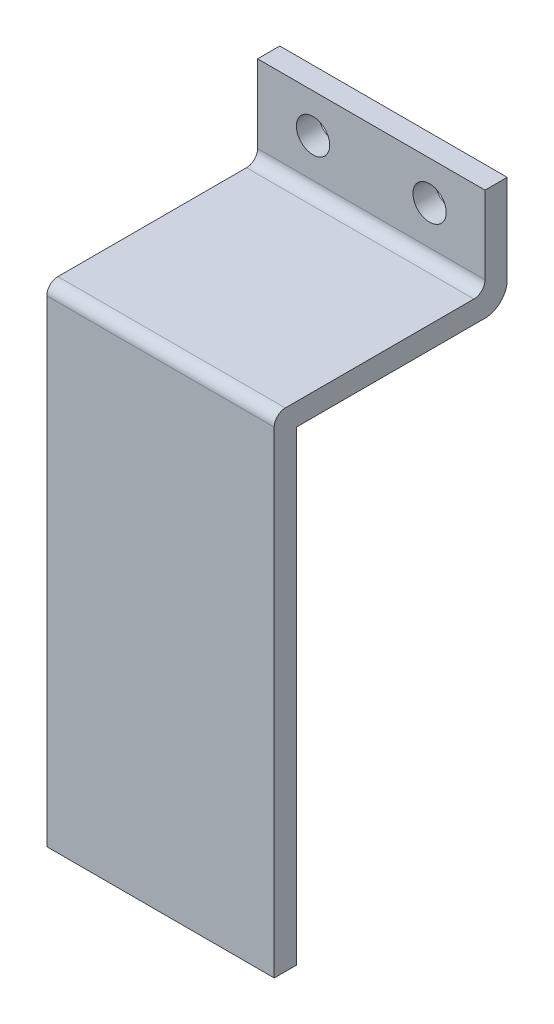
ISO-10303-21;
HEADER;
FILE_DESCRIPTION(('STEP AP214'),'2;1');
FILE_NAME('part.step','',(''),(''),'','','');
FILE_SCHEMA(('AUTOMOTIVE_DESIGN { 1 0 10303 214 1 1 1 1 }'));
ENDSEC;
DATA;
#1=APPLICATION_CONTEXT('core data for automotive mechanical design processes');
#2=APPLICATION_PROTOCOL_DEFINITION('international standard','automotive_design',2000,#1);
#3=PRODUCT_CONTEXT('',#1,'mechanical');
#4=PRODUCT('Part','Part','',(#3));
#5=PRODUCT_RELATED_PRODUCT_CATEGORY('part','',(#4));
#6=PRODUCT_DEFINITION_FORMATION('','',#4);
#7=PRODUCT_DEFINITION_CONTEXT('part definition',#1,'design');
#8=PRODUCT_DEFINITION('design','',#6,#7);
#9=PRODUCT_DEFINITION_SHAPE('','',#8);
#10=(LENGTH_UNIT() NAMED_UNIT(*) SI_UNIT(.MILLI.,.METRE.));
#11=(NAMED_UNIT(*) PLANE_ANGLE_UNIT() SI_UNIT($,.RADIAN.));
#12=(NAMED_UNIT(*) SI_UNIT($,.STERADIAN.) SOLID_ANGLE_UNIT());
#13=UNCERTAINTY_MEASURE_WITH_UNIT(LENGTH_MEASURE(1.E-05),#10,'distance_accuracy_value','');
#14=(GEOMETRIC_REPRESENTATION_CONTEXT(3) GLOBAL_UNCERTAINTY_ASSIGNED_CONTEXT((#13)) GLOBAL_UNIT_ASSIGNED_CONTEXT((#10,
#11,#12)) REPRESENTATION_CONTEXT('',''));
#15=CARTESIAN_POINT('',(0.,0.,0.));
#16=DIRECTION('',(0.,0.,1.));
#17=DIRECTION('',(1.,0.,0.));
#18=AXIS2_PLACEMENT_3D('',#15,#16,#17);
#19=CARTESIAN_POINT('',(20.5,43.,-1.));
#20=DIRECTION('',(-1.,0.,0.));
#21=DIRECTION('',(0.,0.,1.));
#22=AXIS2_PLACEMENT_3D('',#19,#20,#21);
#23=CYLINDRICAL_SURFACE('',#22,1.);
#24=CARTESIAN_POINT('',(0.,43.,-1.));
#25=DIRECTION('',(-1.,0.,0.));
#26=DIRECTION('',(0.,0.,1.));
#27=AXIS2_PLACEMENT_3D('',#24,#25,#26);
#28=CIRCLE('',#27,1.);
#29=CARTESIAN_POINT('',(0.,43.,0.));
#30=VERTEX_POINT('',#29);
#31=CARTESIAN_POINT('',(0.,44.,-1.));
#32=VERTEX_POINT('',#31);
#33=EDGE_CURVE('E147',#30,#32,#28,.T.);
#34=ORIENTED_EDGE('',*,*,#33,.F.);
#35=DIRECTION('',(-1.,0.,0.));
#36=VECTOR('',#35,1.);
#37=CARTESIAN_POINT('',(20.5,43.,0.));
#38=LINE('',#37,#36);
#39=CARTESIAN_POINT('',(20.5,43.,0.));
#40=VERTEX_POINT('',#39);
#41=EDGE_CURVE('E11',#40,#30,#38,.T.);
#42=ORIENTED_EDGE('',*,*,#41,.F.);
#43=CARTESIAN_POINT('',(20.5,43.,-1.));
#44=DIRECTION('',(-1.,0.,0.));
#45=DIRECTION('',(0.,0.,1.));
#46=AXIS2_PLACEMENT_3D('',#43,#44,#45);
#47=CIRCLE('',#46,1.);
#48=CARTESIAN_POINT('',(20.5,44.,-1.));
#49=VERTEX_POINT('',#48);
#50=EDGE_CURVE('E175',#40,#49,#47,.T.);
#51=ORIENTED_EDGE('',*,*,#50,.T.);
#52=DIRECTION('',(-1.,0.,0.));
#53=VECTOR('',#52,1.);
#54=CARTESIAN_POINT('',(20.5,44.,-1.));
#55=LINE('',#54,#53);
#56=EDGE_CURVE('E36',#49,#32,#55,.T.);
#57=ORIENTED_EDGE('',*,*,#56,.T.);
#58=EDGE_LOOP('',(#34,#42,#51,#57));
#59=FACE_BOUND('',#58,.T.);
#60=ADVANCED_FACE('F33',(#59),#23,.T.);
#61=CARTESIAN_POINT('',(20.5,0.,0.));
#62=DIRECTION('',(0.,0.,1.));
#63=DIRECTION('',(1.,0.,0.));
#64=AXIS2_PLACEMENT_3D('',#61,#62,#63);
#65=PLANE('',#64);
#66=DIRECTION('',(0.,1.,0.));
#67=VECTOR('',#66,1.);
#68=CARTESIAN_POINT('',(0.,0.,0.));
#69=LINE('',#68,#67);
#70=CARTESIAN_POINT('',(0.,0.,0.));
#71=VERTEX_POINT('',#70);
#72=EDGE_CURVE('E173',#71,#30,#69,.T.);
#73=ORIENTED_EDGE('',*,*,#72,.F.);
#74=DIRECTION('',(-1.,0.,0.));
#75=VECTOR('',#74,1.);
#76=CARTESIAN_POINT('',(20.5,0.,0.));
#77=LINE('',#76,#75);
#78=CARTESIAN_POINT('',(20.5,0.,0.));
#79=VERTEX_POINT('',#78);
#80=EDGE_CURVE('E42',#79,#71,#77,.T.);
#81=ORIENTED_EDGE('',*,*,#80,.F.);
#82=DIRECTION('',(0.,1.,0.));
#83=VECTOR('',#82,1.);
#84=CARTESIAN_POINT('',(20.5,0.,0.));
#85=LINE('',#84,#83);
#86=EDGE_CURVE('E127',#79,#40,#85,.T.);
#87=ORIENTED_EDGE('',*,*,#86,.T.);
#88=ORIENTED_EDGE('',*,*,#41,.T.);
#89=EDGE_LOOP('',(#73,#81,#87,#88));
#90=FACE_BOUND('',#89,.T.);
#91=ADVANCED_FACE('F195',(#90),#65,.T.);
#92=CARTESIAN_POINT('',(20.5,0.,0.));
#93=DIRECTION('',(0.,1.,0.));
#94=DIRECTION('',(0.,0.,1.));
#95=AXIS2_PLACEMENT_3D('',#92,#93,#94);
#96=PLANE('',#95);
#97=DIRECTION('',(0.,0.,-1.));
#98=VECTOR('',#97,1.);
#99=CARTESIAN_POINT('',(0.,0.,0.));
#100=LINE('',#99,#98);
#101=CARTESIAN_POINT('',(0.,0.,-2.));
#102=VERTEX_POINT('',#101);
#103=EDGE_CURVE('E132',#71,#102,#100,.T.);
#104=ORIENTED_EDGE('',*,*,#103,.T.);
#105=DIRECTION('',(-1.,0.,0.));
#106=VECTOR('',#105,1.);
#107=CARTESIAN_POINT('',(20.5,0.,-2.));
#108=LINE('',#107,#106);
#109=CARTESIAN_POINT('',(20.5,0.,-2.));
#110=VERTEX_POINT('',#109);
#111=EDGE_CURVE('E130',#110,#102,#108,.T.);
#112=ORIENTED_EDGE('',*,*,#111,.F.);
#113=DIRECTION('',(0.,0.,-1.));
#114=VECTOR('',#113,1.);
#115=CARTESIAN_POINT('',(20.5,0.,0.));
#116=LINE('',#115,#114);
#117=EDGE_CURVE('E121',#79,#110,#116,.T.);
#118=ORIENTED_EDGE('',*,*,#117,.F.);
#119=ORIENTED_EDGE('',*,*,#80,.T.);
#120=EDGE_LOOP('',(#104,#112,#118,#119));
#121=FACE_BOUND('',#120,.T.);
#122=ADVANCED_FACE('F131',(#121),#96,.F.);
#123=CARTESIAN_POINT('',(20.5,0.,-2.));
#124=DIRECTION('',(0.,0.,1.));
#125=DIRECTION('',(1.,0.,0.));
#126=AXIS2_PLACEMENT_3D('',#123,#124,#125);
#127=PLANE('',#126);
#128=DIRECTION('',(0.,1.,0.));
#129=VECTOR('',#128,1.);
#130=CARTESIAN_POINT('',(0.,0.,-2.));
#131=LINE('',#130,#129);
#132=CARTESIAN_POINT('',(0.,42.,-2.));
#133=VERTEX_POINT('',#132);
#134=EDGE_CURVE('E170',#102,#133,#131,.T.);
#135=ORIENTED_EDGE('',*,*,#134,.T.);
#136=DIRECTION('',(-1.,0.,0.));
#137=VECTOR('',#136,1.);
#138=CARTESIAN_POINT('',(20.5,42.,-2.));
#139=LINE('',#138,#137);
#140=CARTESIAN_POINT('',(20.5,42.,-2.));
#141=VERTEX_POINT('',#140);
#142=EDGE_CURVE('E135',#141,#133,#139,.T.);
#143=ORIENTED_EDGE('',*,*,#142,.F.);
#144=DIRECTION('',(0.,1.,0.));
#145=VECTOR('',#144,1.);
#146=CARTESIAN_POINT('',(20.5,0.,-2.));
#147=LINE('',#146,#145);
#148=EDGE_CURVE('E125',#110,#141,#147,.T.);
#149=ORIENTED_EDGE('',*,*,#148,.F.);
#150=ORIENTED_EDGE('',*,*,#111,.T.);
#151=EDGE_LOOP('',(#135,#143,#149,#150));
#152=FACE_BOUND('',#151,.T.);
#153=ADVANCED_FACE('F137',(#152),#127,.F.);
#154=CARTESIAN_POINT('',(20.5,42.,-2.));
#155=DIRECTION('',(0.,1.,0.));
#156=DIRECTION('',(0.,0.,1.));
#157=AXIS2_PLACEMENT_3D('',#154,#155,#156);
#158=PLANE('',#157);
#159=DIRECTION('',(0.,0.,-1.));
#160=VECTOR('',#159,1.);
#161=CARTESIAN_POINT('',(0.,42.,-2.));
#162=LINE('',#161,#160);
#163=CARTESIAN_POINT('',(0.,42.,-19.));
#164=VERTEX_POINT('',#163);
#165=EDGE_CURVE('E168',#133,#164,#162,.T.);
#166=ORIENTED_EDGE('',*,*,#165,.T.);
#167=DIRECTION('',(-1.,0.,0.));
#168=VECTOR('',#167,1.);
#169=CARTESIAN_POINT('',(20.5,42.,-19.));
#170=LINE('',#169,#168);
#171=CARTESIAN_POINT('',(20.5,42.,-19.));
#172=VERTEX_POINT('',#171);
#173=EDGE_CURVE('E179',#172,#164,#170,.T.);
#174=ORIENTED_EDGE('',*,*,#173,.F.);
#175=DIRECTION('',(0.,0.,-1.));
#176=VECTOR('',#175,1.);
#177=CARTESIAN_POINT('',(20.5,42.,-2.));
#178=LINE('',#177,#176);
#179=EDGE_CURVE('E140',#141,#172,#178,.T.);
#180=ORIENTED_EDGE('',*,*,#179,.F.);
#181=ORIENTED_EDGE('',*,*,#142,.T.);
#182=EDGE_LOOP('',(#166,#174,#180,#181));
#183=FACE_BOUND('',#182,.T.);
#184=ADVANCED_FACE('F208',(#183),#158,.F.);
#185=CARTESIAN_POINT('',(20.5,44.,-19.));
#186=DIRECTION('',(-1.,0.,0.));
#187=DIRECTION('',(0.,0.,1.));
#188=AXIS2_PLACEMENT_3D('',#185,#186,#187);
#189=CYLINDRICAL_SURFACE('',#188,2.);
#190=CARTESIAN_POINT('',(0.,44.,-19.));
#191=DIRECTION('',(1.,0.,0.));
#192=DIRECTION('',(0.,0.,-1.));
#193=AXIS2_PLACEMENT_3D('',#190,#191,#192);
#194=CIRCLE('',#193,2.);
#195=CARTESIAN_POINT('',(0.,44.,-21.));
#196=VERTEX_POINT('',#195);
#197=EDGE_CURVE('E166',#164,#196,#194,.T.);
#198=ORIENTED_EDGE('',*,*,#197,.T.);
#199=DIRECTION('',(-1.,0.,0.));
#200=VECTOR('',#199,1.);
#201=CARTESIAN_POINT('',(20.5,44.,-21.));
#202=LINE('',#201,#200);
#203=CARTESIAN_POINT('',(20.5,44.,-21.));
#204=VERTEX_POINT('',#203);
#205=EDGE_CURVE('E182',#204,#196,#202,.T.);
#206=ORIENTED_EDGE('',*,*,#205,.F.);
#207=CARTESIAN_POINT('',(20.5,44.,-19.));
#208=DIRECTION('',(1.,0.,0.));
#209=DIRECTION('',(0.,0.,-1.));
#210=AXIS2_PLACEMENT_3D('',#207,#208,#209);
#211=CIRCLE('',#210,2.);
#212=EDGE_CURVE('E142',#172,#204,#211,.T.);
#213=ORIENTED_EDGE('',*,*,#212,.F.);
#214=ORIENTED_EDGE('',*,*,#173,.T.);
#215=EDGE_LOOP('',(#198,#206,#213,#214));
#216=FACE_BOUND('',#215,.T.);
#217=ADVANCED_FACE('F211',(#216),#189,.T.);
#218=CARTESIAN_POINT('',(20.5,44.,-21.));
#219=DIRECTION('',(0.,0.,1.));
#220=DIRECTION('',(1.,0.,0.));
#221=AXIS2_PLACEMENT_3D('',#218,#219,#220);
#222=PLANE('',#221);
#223=CARTESIAN_POINT('',(5.,48.5,-21.));
#224=DIRECTION('',(0.,0.,1.));
#225=DIRECTION('',(1.,0.,0.));
#226=AXIS2_PLACEMENT_3D('',#223,#224,#225);
#227=CIRCLE('',#226,1.5);
#228=CARTESIAN_POINT('',(6.5,48.5,-21.));
#229=VERTEX_POINT('',#228);
#230=EDGE_CURVE('E151',#229,#229,#227,.T.);
#231=ORIENTED_EDGE('',*,*,#230,.T.);
#232=EDGE_LOOP('',(#231));
#233=FACE_BOUND('',#232,.T.);
#234=CARTESIAN_POINT('',(15.5,48.5,-21.));
#235=DIRECTION('',(0.,0.,1.));
#236=DIRECTION('',(-1.,0.,0.));
#237=AXIS2_PLACEMENT_3D('',#234,#235,#236);
#238=CIRCLE('',#237,1.5);
#239=CARTESIAN_POINT('',(14.,48.5,-21.));
#240=VERTEX_POINT('',#239);
#241=EDGE_CURVE('E254',#240,#240,#238,.T.);
#242=ORIENTED_EDGE('',*,*,#241,.T.);
#243=EDGE_LOOP('',(#242));
#244=FACE_BOUND('',#243,.T.);
#245=DIRECTION('',(0.,1.,0.));
#246=VECTOR('',#245,1.);
#247=CARTESIAN_POINT('',(0.,44.,-21.));
#248=LINE('',#247,#246);
#249=CARTESIAN_POINT('',(0.,52.,-21.));
#250=VERTEX_POINT('',#249);
#251=EDGE_CURVE('E163',#196,#250,#248,.T.);
#252=ORIENTED_EDGE('',*,*,#251,.T.);
#253=DIRECTION('',(-1.,0.,0.));
#254=VECTOR('',#253,1.);
#255=CARTESIAN_POINT('',(20.5,52.,-21.));
#256=LINE('',#255,#254);
#257=CARTESIAN_POINT('',(20.5,52.,-21.));
#258=VERTEX_POINT('',#257);
#259=EDGE_CURVE('E185',#258,#250,#256,.T.);
#260=ORIENTED_EDGE('',*,*,#259,.F.);
#261=DIRECTION('',(0.,1.,0.));
#262=VECTOR('',#261,1.);
#263=CARTESIAN_POINT('',(20.5,44.,-21.));
#264=LINE('',#263,#262);
#265=EDGE_CURVE('E275',#204,#258,#264,.T.);
#266=ORIENTED_EDGE('',*,*,#265,.F.);
#267=ORIENTED_EDGE('',*,*,#205,.T.);
#268=EDGE_LOOP('',(#252,#260,#266,#267));
#269=FACE_BOUND('',#268,.T.);
#270=ADVANCED_FACE('F215',(#233,#244,#269),#222,.F.);
#271=CARTESIAN_POINT('',(20.5,52.,-19.));
#272=DIRECTION('',(0.,1.,0.));
#273=DIRECTION('',(0.,0.,1.));
#274=AXIS2_PLACEMENT_3D('',#271,#272,#273);
#275=PLANE('',#274);
#276=DIRECTION('',(0.,0.,-1.));
#277=VECTOR('',#276,1.);
#278=CARTESIAN_POINT('',(0.,52.,-19.));
#279=LINE('',#278,#277);
#280=CARTESIAN_POINT('',(0.,52.,-19.));
#281=VERTEX_POINT('',#280);
#282=EDGE_CURVE('E160',#281,#250,#279,.T.);
#283=ORIENTED_EDGE('',*,*,#282,.F.);
#284=DIRECTION('',(-1.,0.,0.));
#285=VECTOR('',#284,1.);
#286=CARTESIAN_POINT('',(20.5,52.,-19.));
#287=LINE('',#286,#285);
#288=CARTESIAN_POINT('',(20.5,52.,-19.));
#289=VERTEX_POINT('',#288);
#290=EDGE_CURVE('E187',#289,#281,#287,.T.);
#291=ORIENTED_EDGE('',*,*,#290,.F.);
#292=DIRECTION('',(0.,0.,-1.));
#293=VECTOR('',#292,1.);
#294=CARTESIAN_POINT('',(20.5,52.,-19.));
#295=LINE('',#294,#293);
#296=EDGE_CURVE('E272',#289,#258,#295,.T.);
#297=ORIENTED_EDGE('',*,*,#296,.T.);
#298=ORIENTED_EDGE('',*,*,#259,.T.);
#299=EDGE_LOOP('',(#283,#291,#297,#298));
#300=FACE_BOUND('',#299,.T.);
#301=ADVANCED_FACE('F219',(#300),#275,.T.);
#302=CARTESIAN_POINT('',(20.5,45.,-19.));
#303=DIRECTION('',(0.,0.,1.));
#304=DIRECTION('',(1.,0.,0.));
#305=AXIS2_PLACEMENT_3D('',#302,#303,#304);
#306=PLANE('',#305);
#307=CARTESIAN_POINT('',(5.,48.5,-19.));
#308=DIRECTION('',(0.,0.,1.));
#309=DIRECTION('',(1.,0.,0.));
#310=AXIS2_PLACEMENT_3D('',#307,#308,#309);
#311=CIRCLE('',#310,1.5);
#312=CARTESIAN_POINT('',(6.5,48.5,-19.));
#313=VERTEX_POINT('',#312);
#314=EDGE_CURVE('E253',#313,#313,#311,.T.);
#315=ORIENTED_EDGE('',*,*,#314,.F.);
#316=EDGE_LOOP('',(#315));
#317=FACE_BOUND('',#316,.T.);
#318=CARTESIAN_POINT('',(15.5,48.5,-19.));
#319=DIRECTION('',(0.,0.,1.));
#320=DIRECTION('',(-1.,0.,0.));
#321=AXIS2_PLACEMENT_3D('',#318,#319,#320);
#322=CIRCLE('',#321,1.5);
#323=CARTESIAN_POINT('',(14.,48.5,-19.));
#324=VERTEX_POINT('',#323);
#325=EDGE_CURVE('E258',#324,#324,#322,.T.);
#326=ORIENTED_EDGE('',*,*,#325,.F.);
#327=EDGE_LOOP('',(#326));
#328=FACE_BOUND('',#327,.T.);
#329=DIRECTION('',(0.,1.,0.));
#330=VECTOR('',#329,1.);
#331=CARTESIAN_POINT('',(0.,45.,-19.));
#332=LINE('',#331,#330);
#333=CARTESIAN_POINT('',(0.,45.,-19.));
#334=VERTEX_POINT('',#333);
#335=EDGE_CURVE('E157',#334,#281,#332,.T.);
#336=ORIENTED_EDGE('',*,*,#335,.F.);
#337=DIRECTION('',(-1.,0.,0.));
#338=VECTOR('',#337,1.);
#339=CARTESIAN_POINT('',(20.5,45.,-19.));
#340=LINE('',#339,#338);
#341=CARTESIAN_POINT('',(20.5,45.,-19.));
#342=VERTEX_POINT('',#341);
#343=EDGE_CURVE('E189',#342,#334,#340,.T.);
#344=ORIENTED_EDGE('',*,*,#343,.F.);
#345=DIRECTION('',(0.,1.,0.));
#346=VECTOR('',#345,1.);
#347=CARTESIAN_POINT('',(20.5,45.,-19.));
#348=LINE('',#347,#346);
#349=EDGE_CURVE('E269',#342,#289,#348,.T.);
#350=ORIENTED_EDGE('',*,*,#349,.T.);
#351=ORIENTED_EDGE('',*,*,#290,.T.);
#352=EDGE_LOOP('',(#336,#344,#350,#351));
#353=FACE_BOUND('',#352,.T.);
#354=ADVANCED_FACE('F223',(#317,#328,#353),#306,.T.);
#355=CARTESIAN_POINT('',(20.5,45.,-18.));
#356=DIRECTION('',(-1.,0.,0.));
#357=DIRECTION('',(0.,0.,1.));
#358=AXIS2_PLACEMENT_3D('',#355,#356,#357);
#359=CYLINDRICAL_SURFACE('',#358,1.);
#360=CARTESIAN_POINT('',(0.,45.,-18.));
#361=DIRECTION('',(1.,0.,0.));
#362=DIRECTION('',(0.,0.,-1.));
#363=AXIS2_PLACEMENT_3D('',#360,#361,#362);
#364=CIRCLE('',#363,1.);
#365=CARTESIAN_POINT('',(0.,44.,-18.));
#366=VERTEX_POINT('',#365);
#367=EDGE_CURVE('E154',#366,#334,#364,.T.);
#368=ORIENTED_EDGE('',*,*,#367,.F.);
#369=DIRECTION('',(-1.,0.,0.));
#370=VECTOR('',#369,1.);
#371=CARTESIAN_POINT('',(20.5,44.,-18.));
#372=LINE('',#371,#370);
#373=CARTESIAN_POINT('',(20.5,44.,-18.));
#374=VERTEX_POINT('',#373);
#375=EDGE_CURVE('E190',#374,#366,#372,.T.);
#376=ORIENTED_EDGE('',*,*,#375,.F.);
#377=CARTESIAN_POINT('',(20.5,45.,-18.));
#378=DIRECTION('',(1.,0.,0.));
#379=DIRECTION('',(0.,0.,-1.));
#380=AXIS2_PLACEMENT_3D('',#377,#378,#379);
#381=CIRCLE('',#380,1.);
#382=EDGE_CURVE('E266',#374,#342,#381,.T.);
#383=ORIENTED_EDGE('',*,*,#382,.T.);
#384=ORIENTED_EDGE('',*,*,#343,.T.);
#385=EDGE_LOOP('',(#368,#376,#383,#384));
#386=FACE_BOUND('',#385,.T.);
#387=ADVANCED_FACE('F227',(#386),#359,.F.);
#388=CARTESIAN_POINT('',(20.5,44.,-1.));
#389=DIRECTION('',(0.,1.,0.));
#390=DIRECTION('',(0.,0.,1.));
#391=AXIS2_PLACEMENT_3D('',#388,#389,#390);
#392=PLANE('',#391);
#393=DIRECTION('',(0.,0.,-1.));
#394=VECTOR('',#393,1.);
#395=CARTESIAN_POINT('',(0.,44.,-1.));
#396=LINE('',#395,#394);
#397=EDGE_CURVE('E150',#32,#366,#396,.T.);
#398=ORIENTED_EDGE('',*,*,#397,.F.);
#399=ORIENTED_EDGE('',*,*,#56,.F.);
#400=DIRECTION('',(0.,0.,-1.));
#401=VECTOR('',#400,1.);
#402=CARTESIAN_POINT('',(20.5,44.,-1.));
#403=LINE('',#402,#401);
#404=EDGE_CURVE('E264',#49,#374,#403,.T.);
#405=ORIENTED_EDGE('',*,*,#404,.T.);
#406=ORIENTED_EDGE('',*,*,#375,.T.);
#407=EDGE_LOOP('',(#398,#399,#405,#406));
#408=FACE_BOUND('',#407,.T.);
#409=ADVANCED_FACE('F192',(#408),#392,.T.);
#410=CARTESIAN_POINT('',(20.5,43.,-1.));
#411=DIRECTION('',(-1.,0.,0.));
#412=DIRECTION('',(0.,0.,1.));
#413=AXIS2_PLACEMENT_3D('',#410,#411,#412);
#414=PLANE('',#413);
#415=ORIENTED_EDGE('',*,*,#50,.F.);
#416=ORIENTED_EDGE('',*,*,#86,.F.);
#417=ORIENTED_EDGE('',*,*,#117,.T.);
#418=ORIENTED_EDGE('',*,*,#148,.T.);
#419=ORIENTED_EDGE('',*,*,#179,.T.);
#420=ORIENTED_EDGE('',*,*,#212,.T.);
#421=ORIENTED_EDGE('',*,*,#265,.T.);
#422=ORIENTED_EDGE('',*,*,#296,.F.);
#423=ORIENTED_EDGE('',*,*,#349,.F.);
#424=ORIENTED_EDGE('',*,*,#382,.F.);
#425=ORIENTED_EDGE('',*,*,#404,.F.);
#426=EDGE_LOOP('',(#415,#416,#417,#418,#419,#420,#421,#422,#423,#424,#425));
#427=FACE_BOUND('',#426,.T.);
#428=ADVANCED_FACE('F123',(#427),#414,.F.);
#429=CARTESIAN_POINT('',(0.,43.,-1.));
#430=DIRECTION('',(-1.,0.,0.));
#431=DIRECTION('',(0.,0.,1.));
#432=AXIS2_PLACEMENT_3D('',#429,#430,#431);
#433=PLANE('',#432);
#434=ORIENTED_EDGE('',*,*,#33,.T.);
#435=ORIENTED_EDGE('',*,*,#397,.T.);
#436=ORIENTED_EDGE('',*,*,#367,.T.);
#437=ORIENTED_EDGE('',*,*,#335,.T.);
#438=ORIENTED_EDGE('',*,*,#282,.T.);
#439=ORIENTED_EDGE('',*,*,#251,.F.);
#440=ORIENTED_EDGE('',*,*,#197,.F.);
#441=ORIENTED_EDGE('',*,*,#165,.F.);
#442=ORIENTED_EDGE('',*,*,#134,.F.);
#443=ORIENTED_EDGE('',*,*,#103,.F.);
#444=ORIENTED_EDGE('',*,*,#72,.T.);
#445=EDGE_LOOP('',(#434,#435,#436,#437,#438,#439,#440,#441,#442,#443,#444));
#446=FACE_BOUND('',#445,.T.);
#447=ADVANCED_FACE('F194',(#446),#433,.T.);
#448=CARTESIAN_POINT('',(15.5,48.5,-21.));
#449=DIRECTION('',(0.,0.,1.));
#450=DIRECTION('',(1.,0.,0.));
#451=AXIS2_PLACEMENT_3D('',#448,#449,#450);
#452=CYLINDRICAL_SURFACE('',#451,1.5);
#453=ORIENTED_EDGE('',*,*,#241,.F.);
#454=EDGE_LOOP('',(#453));
#455=FACE_BOUND('',#454,.T.);
#456=ORIENTED_EDGE('',*,*,#325,.T.);
#457=EDGE_LOOP('',(#456));
#458=FACE_BOUND('',#457,.T.);
#459=ADVANCED_FACE('F238',(#455,#458),#452,.F.);
#460=CARTESIAN_POINT('',(5.,48.5,-21.));
#461=DIRECTION('',(0.,0.,1.));
#462=DIRECTION('',(1.,0.,0.));
#463=AXIS2_PLACEMENT_3D('',#460,#461,#462);
#464=CYLINDRICAL_SURFACE('',#463,1.5);
#465=ORIENTED_EDGE('',*,*,#230,.F.);
#466=EDGE_LOOP('',(#465));
#467=FACE_BOUND('',#466,.T.);
#468=ORIENTED_EDGE('',*,*,#314,.T.);
#469=EDGE_LOOP('',(#468));
#470=FACE_BOUND('',#469,.T.);
#471=ADVANCED_FACE('F242',(#467,#470),#464,.F.);
#472=CLOSED_SHELL('',(#60,#91,#122,#153,#184,#217,#270,#301,#354,#387,#409,#428,#447,#459,#471));
#473=MANIFOLD_SOLID_BREP('B2',#472);
#474=ADVANCED_BREP_SHAPE_REPRESENTATION('',(#18,#473),#14);
#475=SHAPE_DEFINITION_REPRESENTATION(#9,#474);
ENDSEC;
END-ISO-10303-21;
